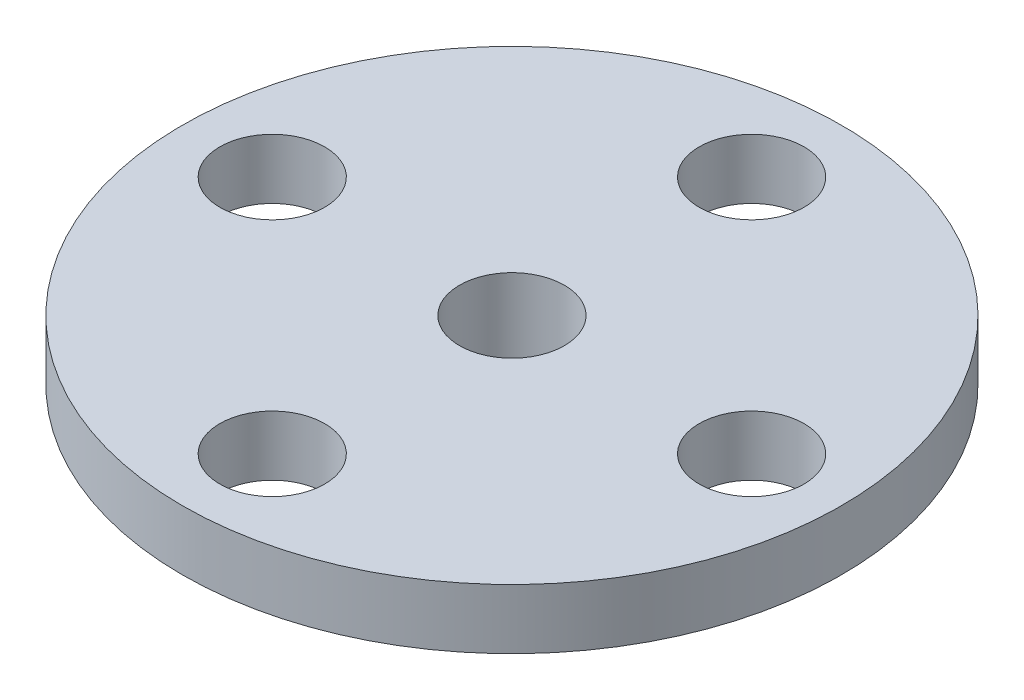
ISO-10303-21;
HEADER;
FILE_DESCRIPTION(('STEP AP214'),'2;1');
FILE_NAME('part.step','',(''),(''),'','','');
FILE_SCHEMA(('AUTOMOTIVE_DESIGN { 1 0 10303 214 1 1 1 1 }'));
ENDSEC;
DATA;
#1=APPLICATION_CONTEXT('core data for automotive mechanical design processes');
#2=APPLICATION_PROTOCOL_DEFINITION('international standard','automotive_design',2000,#1);
#3=PRODUCT_CONTEXT('',#1,'mechanical');
#4=PRODUCT('Part','Part','',(#3));
#5=PRODUCT_RELATED_PRODUCT_CATEGORY('part','',(#4));
#6=PRODUCT_DEFINITION_FORMATION('','',#4);
#7=PRODUCT_DEFINITION_CONTEXT('part definition',#1,'design');
#8=PRODUCT_DEFINITION('design','',#6,#7);
#9=PRODUCT_DEFINITION_SHAPE('','',#8);
#10=(LENGTH_UNIT() NAMED_UNIT(*) SI_UNIT(.MILLI.,.METRE.));
#11=(NAMED_UNIT(*) PLANE_ANGLE_UNIT() SI_UNIT($,.RADIAN.));
#12=(NAMED_UNIT(*) SI_UNIT($,.STERADIAN.) SOLID_ANGLE_UNIT());
#13=UNCERTAINTY_MEASURE_WITH_UNIT(LENGTH_MEASURE(1.E-05),#10,'distance_accuracy_value','');
#14=(GEOMETRIC_REPRESENTATION_CONTEXT(3) GLOBAL_UNCERTAINTY_ASSIGNED_CONTEXT((#13)) GLOBAL_UNIT_ASSIGNED_CONTEXT((#10,
#11,#12)) REPRESENTATION_CONTEXT('',''));
#15=CARTESIAN_POINT('',(0.,0.,0.));
#16=DIRECTION('',(0.,0.,1.));
#17=DIRECTION('',(1.,0.,0.));
#18=AXIS2_PLACEMENT_3D('',#15,#16,#17);
#19=CARTESIAN_POINT('',(11.,0.,0.));
#20=DIRECTION('',(0.,-1.,0.));
#21=DIRECTION('',(0.,0.,-1.));
#22=AXIS2_PLACEMENT_3D('',#19,#20,#21);
#23=PLANE('',#22);
#24=CARTESIAN_POINT('',(8.,0.,0.));
#25=DIRECTION('',(0.,-1.,0.));
#26=DIRECTION('',(0.,0.,-1.));
#27=AXIS2_PLACEMENT_3D('',#24,#25,#26);
#28=CIRCLE('',#27,1.74999999999999);
#29=CARTESIAN_POINT('',(8.,0.,-1.74999999999999));
#30=VERTEX_POINT('',#29);
#31=EDGE_CURVE('E72',#30,#30,#28,.T.);
#32=ORIENTED_EDGE('',*,*,#31,.F.);
#33=EDGE_LOOP('',(#32));
#34=FACE_BOUND('',#33,.T.);
#35=CARTESIAN_POINT('',(0.,0.,8.));
#36=DIRECTION('',(0.,-1.,0.));
#37=DIRECTION('',(0.,0.,-1.));
#38=AXIS2_PLACEMENT_3D('',#35,#36,#37);
#39=CIRCLE('',#38,1.74999999999999);
#40=CARTESIAN_POINT('',(0.,0.,6.25000000000001));
#41=VERTEX_POINT('',#40);
#42=EDGE_CURVE('E66',#41,#41,#39,.T.);
#43=ORIENTED_EDGE('',*,*,#42,.F.);
#44=EDGE_LOOP('',(#43));
#45=FACE_BOUND('',#44,.T.);
#46=CARTESIAN_POINT('',(-8.,0.,0.));
#47=DIRECTION('',(0.,-1.,0.));
#48=DIRECTION('',(0.,0.,-1.));
#49=AXIS2_PLACEMENT_3D('',#46,#47,#48);
#50=CIRCLE('',#49,1.74999999999999);
#51=CARTESIAN_POINT('',(-8.,0.,-1.74999999999999));
#52=VERTEX_POINT('',#51);
#53=EDGE_CURVE('E60',#52,#52,#50,.T.);
#54=ORIENTED_EDGE('',*,*,#53,.F.);
#55=EDGE_LOOP('',(#54));
#56=FACE_BOUND('',#55,.T.);
#57=CARTESIAN_POINT('',(0.,0.,-8.));
#58=DIRECTION('',(0.,-1.,0.));
#59=DIRECTION('',(0.,0.,-1.));
#60=AXIS2_PLACEMENT_3D('',#57,#58,#59);
#61=CIRCLE('',#60,1.74999999999999);
#62=CARTESIAN_POINT('',(0.,0.,-9.74999999999999));
#63=VERTEX_POINT('',#62);
#64=EDGE_CURVE('E54',#63,#63,#61,.T.);
#65=ORIENTED_EDGE('',*,*,#64,.F.);
#66=EDGE_LOOP('',(#65));
#67=FACE_BOUND('',#66,.T.);
#68=CARTESIAN_POINT('',(0.,0.,0.));
#69=DIRECTION('',(0.,1.,0.));
#70=DIRECTION('',(0.,0.,1.));
#71=AXIS2_PLACEMENT_3D('',#68,#69,#70);
#72=CIRCLE('',#71,11.);
#73=CARTESIAN_POINT('',(0.,0.,11.));
#74=VERTEX_POINT('',#73);
#75=EDGE_CURVE('E10',#74,#74,#72,.T.);
#76=ORIENTED_EDGE('',*,*,#75,.F.);
#77=EDGE_LOOP('',(#76));
#78=FACE_BOUND('',#77,.T.);
#79=CARTESIAN_POINT('',(0.,0.,0.));
#80=DIRECTION('',(0.,-1.,0.));
#81=DIRECTION('',(0.,0.,-1.));
#82=AXIS2_PLACEMENT_3D('',#79,#80,#81);
#83=CIRCLE('',#82,4.4);
#84=CARTESIAN_POINT('',(0.,0.,-4.4));
#85=VERTEX_POINT('',#84);
#86=EDGE_CURVE('E46',#85,#85,#83,.T.);
#87=ORIENTED_EDGE('',*,*,#86,.F.);
#88=EDGE_LOOP('',(#87));
#89=FACE_BOUND('',#88,.T.);
#90=ADVANCED_FACE('F31',(#34,#45,#56,#67,#78,#89),#23,.T.);
#91=CARTESIAN_POINT('',(0.,0.,0.));
#92=DIRECTION('',(0.,1.,0.));
#93=DIRECTION('',(0.,0.,1.));
#94=AXIS2_PLACEMENT_3D('',#91,#92,#93);
#95=CYLINDRICAL_SURFACE('',#94,11.);
#96=ORIENTED_EDGE('',*,*,#75,.T.);
#97=EDGE_LOOP('',(#96));
#98=FACE_BOUND('',#97,.T.);
#99=CARTESIAN_POINT('',(0.,2.,0.));
#100=DIRECTION('',(0.,1.,0.));
#101=DIRECTION('',(0.,0.,1.));
#102=AXIS2_PLACEMENT_3D('',#99,#100,#101);
#103=CIRCLE('',#102,11.);
#104=CARTESIAN_POINT('',(0.,2.,11.));
#105=VERTEX_POINT('',#104);
#106=EDGE_CURVE('E38',#105,#105,#103,.T.);
#107=ORIENTED_EDGE('',*,*,#106,.F.);
#108=EDGE_LOOP('',(#107));
#109=FACE_BOUND('',#108,.T.);
#110=ADVANCED_FACE('F33',(#98,#109),#95,.T.);
#111=CARTESIAN_POINT('',(0.,2.,0.));
#112=DIRECTION('',(0.,1.,0.));
#113=DIRECTION('',(0.,0.,1.));
#114=AXIS2_PLACEMENT_3D('',#111,#112,#113);
#115=PLANE('',#114);
#116=CARTESIAN_POINT('',(0.,2.,0.));
#117=DIRECTION('',(0.,-1.,0.));
#118=DIRECTION('',(0.,0.,-1.));
#119=AXIS2_PLACEMENT_3D('',#116,#117,#118);
#120=CIRCLE('',#119,1.75000000000001);
#121=CARTESIAN_POINT('',(0.,2.,-1.75000000000001));
#122=VERTEX_POINT('',#121);
#123=EDGE_CURVE('E75',#122,#122,#120,.T.);
#124=ORIENTED_EDGE('',*,*,#123,.T.);
#125=EDGE_LOOP('',(#124));
#126=FACE_BOUND('',#125,.T.);
#127=CARTESIAN_POINT('',(8.,2.,0.));
#128=DIRECTION('',(0.,-1.,0.));
#129=DIRECTION('',(0.,0.,-1.));
#130=AXIS2_PLACEMENT_3D('',#127,#128,#129);
#131=CIRCLE('',#130,1.74999999999999);
#132=CARTESIAN_POINT('',(8.,2.,-1.74999999999999));
#133=VERTEX_POINT('',#132);
#134=EDGE_CURVE('E69',#133,#133,#131,.T.);
#135=ORIENTED_EDGE('',*,*,#134,.T.);
#136=EDGE_LOOP('',(#135));
#137=FACE_BOUND('',#136,.T.);
#138=CARTESIAN_POINT('',(0.,2.,8.));
#139=DIRECTION('',(0.,-1.,0.));
#140=DIRECTION('',(0.,0.,-1.));
#141=AXIS2_PLACEMENT_3D('',#138,#139,#140);
#142=CIRCLE('',#141,1.74999999999999);
#143=CARTESIAN_POINT('',(0.,2.,6.25000000000001));
#144=VERTEX_POINT('',#143);
#145=EDGE_CURVE('E63',#144,#144,#142,.T.);
#146=ORIENTED_EDGE('',*,*,#145,.T.);
#147=EDGE_LOOP('',(#146));
#148=FACE_BOUND('',#147,.T.);
#149=CARTESIAN_POINT('',(-8.,2.,0.));
#150=DIRECTION('',(0.,-1.,0.));
#151=DIRECTION('',(0.,0.,-1.));
#152=AXIS2_PLACEMENT_3D('',#149,#150,#151);
#153=CIRCLE('',#152,1.74999999999999);
#154=CARTESIAN_POINT('',(-8.,2.,-1.74999999999999));
#155=VERTEX_POINT('',#154);
#156=EDGE_CURVE('E57',#155,#155,#153,.T.);
#157=ORIENTED_EDGE('',*,*,#156,.T.);
#158=EDGE_LOOP('',(#157));
#159=FACE_BOUND('',#158,.T.);
#160=CARTESIAN_POINT('',(0.,2.,-8.));
#161=DIRECTION('',(0.,-1.,0.));
#162=DIRECTION('',(0.,0.,-1.));
#163=AXIS2_PLACEMENT_3D('',#160,#161,#162);
#164=CIRCLE('',#163,1.74999999999999);
#165=CARTESIAN_POINT('',(0.,2.,-9.74999999999999));
#166=VERTEX_POINT('',#165);
#167=EDGE_CURVE('E50',#166,#166,#164,.T.);
#168=ORIENTED_EDGE('',*,*,#167,.T.);
#169=EDGE_LOOP('',(#168));
#170=FACE_BOUND('',#169,.T.);
#171=ORIENTED_EDGE('',*,*,#106,.T.);
#172=EDGE_LOOP('',(#171));
#173=FACE_BOUND('',#172,.T.);
#174=ADVANCED_FACE('F100',(#126,#137,#148,#159,#170,#173),#115,.T.);
#175=CARTESIAN_POINT('',(0.,-4.2,0.));
#176=DIRECTION('',(0.,1.,0.));
#177=DIRECTION('',(0.,0.,1.));
#178=AXIS2_PLACEMENT_3D('',#175,#176,#177);
#179=CYLINDRICAL_SURFACE('',#178,4.4);
#180=CARTESIAN_POINT('',(0.,-4.2,0.));
#181=DIRECTION('',(0.,-1.,0.));
#182=DIRECTION('',(0.,0.,-1.));
#183=AXIS2_PLACEMENT_3D('',#180,#181,#182);
#184=CIRCLE('',#183,4.4);
#185=CARTESIAN_POINT('',(0.,-4.2,-4.4));
#186=VERTEX_POINT('',#185);
#187=EDGE_CURVE('E42',#186,#186,#184,.T.);
#188=ORIENTED_EDGE('',*,*,#187,.F.);
#189=EDGE_LOOP('',(#188));
#190=FACE_BOUND('',#189,.T.);
#191=ORIENTED_EDGE('',*,*,#86,.T.);
#192=EDGE_LOOP('',(#191));
#193=FACE_BOUND('',#192,.T.);
#194=ADVANCED_FACE('F94',(#190,#193),#179,.T.);
#195=CARTESIAN_POINT('',(0.,-4.2,0.));
#196=DIRECTION('',(0.,-1.,0.));
#197=DIRECTION('',(0.,0.,-1.));
#198=AXIS2_PLACEMENT_3D('',#195,#196,#197);
#199=PLANE('',#198);
#200=CARTESIAN_POINT('',(0.,-4.2,0.));
#201=DIRECTION('',(0.,-1.,0.));
#202=DIRECTION('',(0.,0.,-1.));
#203=AXIS2_PLACEMENT_3D('',#200,#201,#202);
#204=CIRCLE('',#203,2.84999999999999);
#205=CARTESIAN_POINT('',(0.,-4.2,-2.84999999999999));
#206=VERTEX_POINT('',#205);
#207=EDGE_CURVE('E84',#206,#206,#204,.T.);
#208=ORIENTED_EDGE('',*,*,#207,.F.);
#209=EDGE_LOOP('',(#208));
#210=FACE_BOUND('',#209,.T.);
#211=ORIENTED_EDGE('',*,*,#187,.T.);
#212=EDGE_LOOP('',(#211));
#213=FACE_BOUND('',#212,.T.);
#214=ADVANCED_FACE('F90',(#210,#213),#199,.T.);
#215=CARTESIAN_POINT('',(0.,0.,-8.));
#216=DIRECTION('',(0.,-1.,0.));
#217=DIRECTION('',(0.,0.,-1.));
#218=AXIS2_PLACEMENT_3D('',#215,#216,#217);
#219=CYLINDRICAL_SURFACE('',#218,1.74999999999999);
#220=ORIENTED_EDGE('',*,*,#167,.F.);
#221=EDGE_LOOP('',(#220));
#222=FACE_BOUND('',#221,.T.);
#223=ORIENTED_EDGE('',*,*,#64,.T.);
#224=EDGE_LOOP('',(#223));
#225=FACE_BOUND('',#224,.T.);
#226=ADVANCED_FACE('F93',(#222,#225),#219,.F.);
#227=CARTESIAN_POINT('',(-8.,0.,0.));
#228=DIRECTION('',(0.,-1.,0.));
#229=DIRECTION('',(0.,0.,-1.));
#230=AXIS2_PLACEMENT_3D('',#227,#228,#229);
#231=CYLINDRICAL_SURFACE('',#230,1.74999999999999);
#232=ORIENTED_EDGE('',*,*,#156,.F.);
#233=EDGE_LOOP('',(#232));
#234=FACE_BOUND('',#233,.T.);
#235=ORIENTED_EDGE('',*,*,#53,.T.);
#236=EDGE_LOOP('',(#235));
#237=FACE_BOUND('',#236,.T.);
#238=ADVANCED_FACE('F117',(#234,#237),#231,.F.);
#239=CARTESIAN_POINT('',(0.,0.,8.));
#240=DIRECTION('',(0.,-1.,0.));
#241=DIRECTION('',(0.,0.,-1.));
#242=AXIS2_PLACEMENT_3D('',#239,#240,#241);
#243=CYLINDRICAL_SURFACE('',#242,1.74999999999999);
#244=ORIENTED_EDGE('',*,*,#145,.F.);
#245=EDGE_LOOP('',(#244));
#246=FACE_BOUND('',#245,.T.);
#247=ORIENTED_EDGE('',*,*,#42,.T.);
#248=EDGE_LOOP('',(#247));
#249=FACE_BOUND('',#248,.T.);
#250=ADVANCED_FACE('F121',(#246,#249),#243,.F.);
#251=CARTESIAN_POINT('',(8.,0.,0.));
#252=DIRECTION('',(0.,-1.,0.));
#253=DIRECTION('',(0.,0.,-1.));
#254=AXIS2_PLACEMENT_3D('',#251,#252,#253);
#255=CYLINDRICAL_SURFACE('',#254,1.74999999999999);
#256=ORIENTED_EDGE('',*,*,#134,.F.);
#257=EDGE_LOOP('',(#256));
#258=FACE_BOUND('',#257,.T.);
#259=ORIENTED_EDGE('',*,*,#31,.T.);
#260=EDGE_LOOP('',(#259));
#261=FACE_BOUND('',#260,.T.);
#262=ADVANCED_FACE('F125',(#258,#261),#255,.F.);
#263=CARTESIAN_POINT('',(0.,-4.2,0.));
#264=DIRECTION('',(0.,-1.,0.));
#265=DIRECTION('',(0.,0.,-1.));
#266=AXIS2_PLACEMENT_3D('',#263,#264,#265);
#267=CYLINDRICAL_SURFACE('',#266,1.75000000000001);
#268=ORIENTED_EDGE('',*,*,#123,.F.);
#269=EDGE_LOOP('',(#268));
#270=FACE_BOUND('',#269,.T.);
#271=CARTESIAN_POINT('',(0.,-1.2,0.));
#272=DIRECTION('',(0.,-1.,0.));
#273=DIRECTION('',(0.,0.,-1.));
#274=AXIS2_PLACEMENT_3D('',#271,#272,#273);
#275=CIRCLE('',#274,1.75000000000001);
#276=CARTESIAN_POINT('',(0.,-1.2,-1.75000000000001));
#277=VERTEX_POINT('',#276);
#278=EDGE_CURVE('E78',#277,#277,#275,.T.);
#279=ORIENTED_EDGE('',*,*,#278,.T.);
#280=EDGE_LOOP('',(#279));
#281=FACE_BOUND('',#280,.T.);
#282=ADVANCED_FACE('F129',(#270,#281),#267,.F.);
#283=CARTESIAN_POINT('',(1.75000000000001,-1.2,0.));
#284=DIRECTION('',(0.,1.,0.));
#285=DIRECTION('',(0.,0.,1.));
#286=AXIS2_PLACEMENT_3D('',#283,#284,#285);
#287=PLANE('',#286);
#288=ORIENTED_EDGE('',*,*,#278,.F.);
#289=EDGE_LOOP('',(#288));
#290=FACE_BOUND('',#289,.T.);
#291=CARTESIAN_POINT('',(0.,-1.2,0.));
#292=DIRECTION('',(0.,-1.,0.));
#293=DIRECTION('',(0.,0.,-1.));
#294=AXIS2_PLACEMENT_3D('',#291,#292,#293);
#295=CIRCLE('',#294,2.84999999999999);
#296=CARTESIAN_POINT('',(0.,-1.2,-2.84999999999999));
#297=VERTEX_POINT('',#296);
#298=EDGE_CURVE('E81',#297,#297,#295,.T.);
#299=ORIENTED_EDGE('',*,*,#298,.T.);
#300=EDGE_LOOP('',(#299));
#301=FACE_BOUND('',#300,.T.);
#302=ADVANCED_FACE('F133',(#290,#301),#287,.F.);
#303=CARTESIAN_POINT('',(0.,-4.2,0.));
#304=DIRECTION('',(0.,-1.,0.));
#305=DIRECTION('',(0.,0.,-1.));
#306=AXIS2_PLACEMENT_3D('',#303,#304,#305);
#307=CYLINDRICAL_SURFACE('',#306,2.84999999999999);
#308=ORIENTED_EDGE('',*,*,#298,.F.);
#309=EDGE_LOOP('',(#308));
#310=FACE_BOUND('',#309,.T.);
#311=ORIENTED_EDGE('',*,*,#207,.T.);
#312=EDGE_LOOP('',(#311));
#313=FACE_BOUND('',#312,.T.);
#314=ADVANCED_FACE('F88',(#310,#313),#307,.F.);
#315=CLOSED_SHELL('',(#90,#110,#174,#194,#214,#226,#238,#250,#262,#282,#302,#314));
#316=MANIFOLD_SOLID_BREP('B2',#315);
#317=ADVANCED_BREP_SHAPE_REPRESENTATION('',(#18,#316),#14);
#318=SHAPE_DEFINITION_REPRESENTATION(#9,#317);
ENDSEC;
END-ISO-10303-21;
